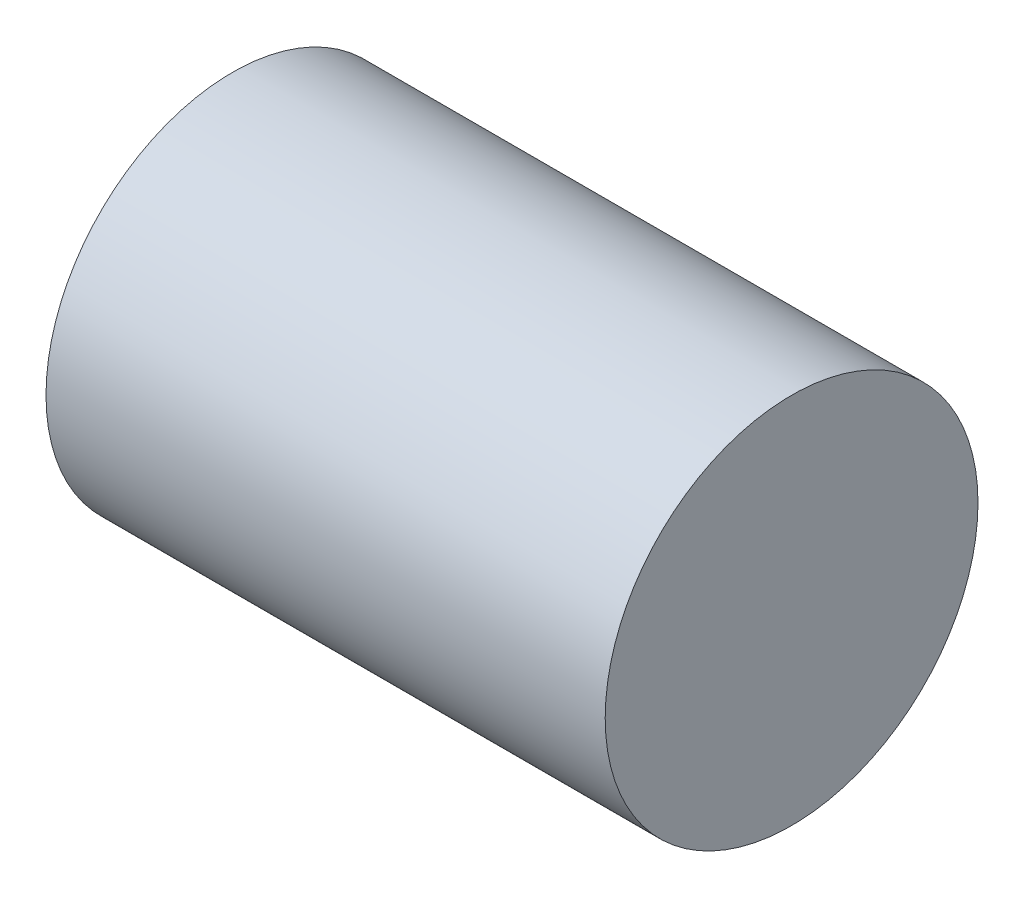
ISO-10303-21;
HEADER;
FILE_DESCRIPTION(('STEP AP214'),'2;1');
FILE_NAME('part.step','',(''),(''),'','','');
FILE_SCHEMA(('AUTOMOTIVE_DESIGN { 1 0 10303 214 1 1 1 1 }'));
ENDSEC;
DATA;
#1=APPLICATION_CONTEXT('core data for automotive mechanical design processes');
#2=APPLICATION_PROTOCOL_DEFINITION('international standard','automotive_design',2000,#1);
#3=PRODUCT_CONTEXT('',#1,'mechanical');
#4=PRODUCT('Part','Part','',(#3));
#5=PRODUCT_RELATED_PRODUCT_CATEGORY('part','',(#4));
#6=PRODUCT_DEFINITION_FORMATION('','',#4);
#7=PRODUCT_DEFINITION_CONTEXT('part definition',#1,'design');
#8=PRODUCT_DEFINITION('design','',#6,#7);
#9=PRODUCT_DEFINITION_SHAPE('','',#8);
#10=(LENGTH_UNIT() NAMED_UNIT(*) SI_UNIT(.MILLI.,.METRE.));
#11=(NAMED_UNIT(*) PLANE_ANGLE_UNIT() SI_UNIT($,.RADIAN.));
#12=(NAMED_UNIT(*) SI_UNIT($,.STERADIAN.) SOLID_ANGLE_UNIT());
#13=UNCERTAINTY_MEASURE_WITH_UNIT(LENGTH_MEASURE(1.E-05),#10,'distance_accuracy_value','');
#14=(GEOMETRIC_REPRESENTATION_CONTEXT(3) GLOBAL_UNCERTAINTY_ASSIGNED_CONTEXT((#13)) GLOBAL_UNIT_ASSIGNED_CONTEXT((#10,
#11,#12)) REPRESENTATION_CONTEXT('',''));
#15=CARTESIAN_POINT('',(0.,0.,0.));
#16=DIRECTION('',(0.,0.,1.));
#17=DIRECTION('',(1.,0.,0.));
#18=AXIS2_PLACEMENT_3D('',#15,#16,#17);
#19=CARTESIAN_POINT('',(-30.,0.,0.));
#20=DIRECTION('',(1.,0.,0.));
#21=DIRECTION('',(0.,0.,-1.));
#22=AXIS2_PLACEMENT_3D('',#19,#20,#21);
#23=CYLINDRICAL_SURFACE('',#22,10.);
#24=CARTESIAN_POINT('',(-30.,0.,0.));
#25=DIRECTION('',(1.,0.,0.));
#26=DIRECTION('',(0.,0.,-1.));
#27=AXIS2_PLACEMENT_3D('',#24,#25,#26);
#28=CIRCLE('',#27,10.);
#29=CARTESIAN_POINT('',(-30.,0.,-10.));
#30=VERTEX_POINT('',#29);
#31=EDGE_CURVE('E10',#30,#30,#28,.T.);
#32=ORIENTED_EDGE('',*,*,#31,.T.);
#33=EDGE_LOOP('',(#32));
#34=FACE_BOUND('',#33,.T.);
#35=CARTESIAN_POINT('',(0.,0.,0.));
#36=DIRECTION('',(1.,0.,0.));
#37=DIRECTION('',(0.,0.,-1.));
#38=AXIS2_PLACEMENT_3D('',#35,#36,#37);
#39=CIRCLE('',#38,10.);
#40=CARTESIAN_POINT('',(0.,0.,-10.));
#41=VERTEX_POINT('',#40);
#42=EDGE_CURVE('E40',#41,#41,#39,.T.);
#43=ORIENTED_EDGE('',*,*,#42,.F.);
#44=EDGE_LOOP('',(#43));
#45=FACE_BOUND('',#44,.T.);
#46=ADVANCED_FACE('F37',(#34,#45),#23,.T.);
#47=CARTESIAN_POINT('',(-30.,0.,0.));
#48=DIRECTION('',(1.,0.,0.));
#49=DIRECTION('',(0.,0.,-1.));
#50=AXIS2_PLACEMENT_3D('',#47,#48,#49);
#51=PLANE('',#50);
#52=ORIENTED_EDGE('',*,*,#31,.F.);
#53=EDGE_LOOP('',(#52));
#54=FACE_BOUND('',#53,.T.);
#55=ADVANCED_FACE('F52',(#54),#51,.F.);
#56=CARTESIAN_POINT('',(0.,0.,0.));
#57=DIRECTION('',(1.,0.,0.));
#58=DIRECTION('',(0.,0.,-1.));
#59=AXIS2_PLACEMENT_3D('',#56,#57,#58);
#60=PLANE('',#59);
#61=ORIENTED_EDGE('',*,*,#42,.T.);
#62=EDGE_LOOP('',(#61));
#63=FACE_BOUND('',#62,.T.);
#64=ADVANCED_FACE('F49',(#63),#60,.T.);
#65=CLOSED_SHELL('',(#46,#55,#64));
#66=MANIFOLD_SOLID_BREP('B2',#65);
#67=ADVANCED_BREP_SHAPE_REPRESENTATION('',(#18,#66),#14);
#68=SHAPE_DEFINITION_REPRESENTATION(#9,#67);
ENDSEC;
END-ISO-10303-21;
